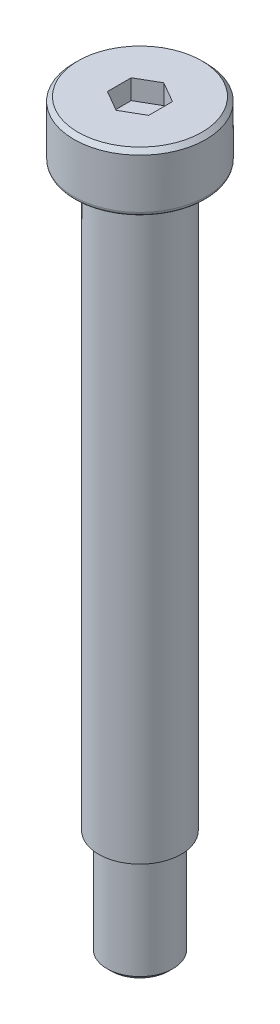
ISO-10303-21;
HEADER;
FILE_DESCRIPTION(('STEP AP214'),'2;1');
FILE_NAME('part.step','',(''),(''),'','','');
FILE_SCHEMA(('AUTOMOTIVE_DESIGN { 1 0 10303 214 1 1 1 1 }'));
ENDSEC;
DATA;
#1=APPLICATION_CONTEXT('core data for automotive mechanical design processes');
#2=APPLICATION_PROTOCOL_DEFINITION('international standard','automotive_design',2000,#1);
#3=PRODUCT_CONTEXT('',#1,'mechanical');
#4=PRODUCT('Part','Part','',(#3));
#5=PRODUCT_RELATED_PRODUCT_CATEGORY('part','',(#4));
#6=PRODUCT_DEFINITION_FORMATION('','',#4);
#7=PRODUCT_DEFINITION_CONTEXT('part definition',#1,'design');
#8=PRODUCT_DEFINITION('design','',#6,#7);
#9=PRODUCT_DEFINITION_SHAPE('','',#8);
#10=(LENGTH_UNIT() NAMED_UNIT(*) SI_UNIT(.MILLI.,.METRE.));
#11=(NAMED_UNIT(*) PLANE_ANGLE_UNIT() SI_UNIT($,.RADIAN.));
#12=(NAMED_UNIT(*) SI_UNIT($,.STERADIAN.) SOLID_ANGLE_UNIT());
#13=UNCERTAINTY_MEASURE_WITH_UNIT(LENGTH_MEASURE(1.E-05),#10,'distance_accuracy_value','');
#14=(GEOMETRIC_REPRESENTATION_CONTEXT(3) GLOBAL_UNCERTAINTY_ASSIGNED_CONTEXT((#13)) GLOBAL_UNIT_ASSIGNED_CONTEXT((#10,
#11,#12)) REPRESENTATION_CONTEXT('',''));
#15=CARTESIAN_POINT('',(0.,0.,0.));
#16=DIRECTION('',(0.,0.,1.));
#17=DIRECTION('',(1.,0.,0.));
#18=AXIS2_PLACEMENT_3D('',#15,#16,#17);
#19=CARTESIAN_POINT('',(0.,0.,0.));
#20=DIRECTION('',(0.,-1.,0.));
#21=DIRECTION('',(1.,0.,0.));
#22=AXIS2_PLACEMENT_3D('',#19,#20,#21);
#23=PLANE('',#22);
#24=CARTESIAN_POINT('',(0.,0.,0.));
#25=DIRECTION('',(0.,-1.,0.));
#26=DIRECTION('',(1.,0.,0.));
#27=AXIS2_PLACEMENT_3D('',#24,#25,#26);
#28=CIRCLE('',#27,7.49999999999998);
#29=CARTESIAN_POINT('',(7.49999999999998,0.,0.));
#30=VERTEX_POINT('',#29);
#31=EDGE_CURVE('E165',#30,#30,#28,.F.);
#32=ORIENTED_EDGE('',*,*,#31,.T.);
#33=EDGE_LOOP('',(#32));
#34=FACE_BOUND('',#33,.T.);
#35=DIRECTION('',(0.866025403784439,0.,-0.5));
#36=VECTOR('',#35,1.);
#37=CARTESIAN_POINT('',(0.,0.,2.88675134594813));
#38=LINE('',#37,#36);
#39=CARTESIAN_POINT('',(0.,0.,2.88675134594813));
#40=VERTEX_POINT('',#39);
#41=CARTESIAN_POINT('',(2.5,0.,1.44337567297407));
#42=VERTEX_POINT('',#41);
#43=EDGE_CURVE('E132',#40,#42,#38,.T.);
#44=ORIENTED_EDGE('',*,*,#43,.F.);
#45=DIRECTION('',(0.866025403784439,0.,0.5));
#46=VECTOR('',#45,1.);
#47=CARTESIAN_POINT('',(-2.5,0.,1.44337567297406));
#48=LINE('',#47,#46);
#49=CARTESIAN_POINT('',(-2.5,0.,1.44337567297406));
#50=VERTEX_POINT('',#49);
#51=EDGE_CURVE('E58',#50,#40,#48,.T.);
#52=ORIENTED_EDGE('',*,*,#51,.F.);
#53=DIRECTION('',(0.,0.,1.));
#54=VECTOR('',#53,1.);
#55=CARTESIAN_POINT('',(-2.5,0.,-1.44337567297407));
#56=LINE('',#55,#54);
#57=CARTESIAN_POINT('',(-2.5,0.,-1.44337567297407));
#58=VERTEX_POINT('',#57);
#59=EDGE_CURVE('E141',#58,#50,#56,.T.);
#60=ORIENTED_EDGE('',*,*,#59,.F.);
#61=DIRECTION('',(-0.866025403784439,0.,0.5));
#62=VECTOR('',#61,1.);
#63=CARTESIAN_POINT('',(0.,0.,-2.88675134594813));
#64=LINE('',#63,#62);
#65=CARTESIAN_POINT('',(0.,0.,-2.88675134594813));
#66=VERTEX_POINT('',#65);
#67=EDGE_CURVE('E139',#66,#58,#64,.T.);
#68=ORIENTED_EDGE('',*,*,#67,.F.);
#69=DIRECTION('',(-0.866025403784439,0.,-0.5));
#70=VECTOR('',#69,1.);
#71=CARTESIAN_POINT('',(2.5,0.,-1.44337567297407));
#72=LINE('',#71,#70);
#73=CARTESIAN_POINT('',(2.5,0.,-1.44337567297407));
#74=VERTEX_POINT('',#73);
#75=EDGE_CURVE('E106',#74,#66,#72,.T.);
#76=ORIENTED_EDGE('',*,*,#75,.F.);
#77=DIRECTION('',(0.,0.,-1.));
#78=VECTOR('',#77,1.);
#79=CARTESIAN_POINT('',(2.5,0.,1.44337567297407));
#80=LINE('',#79,#78);
#81=EDGE_CURVE('E135',#42,#74,#80,.T.);
#82=ORIENTED_EDGE('',*,*,#81,.F.);
#83=EDGE_LOOP('',(#44,#52,#60,#68,#76,#82));
#84=FACE_BOUND('',#83,.T.);
#85=ADVANCED_FACE('F42',(#34,#84),#23,.F.);
#86=CARTESIAN_POINT('',(0.,5.,0.));
#87=DIRECTION('',(0.,1.,0.));
#88=DIRECTION('',(-1.,0.,0.));
#89=AXIS2_PLACEMENT_3D('',#86,#87,#88);
#90=CYLINDRICAL_SURFACE('',#89,8.);
#91=CARTESIAN_POINT('',(0.,-6.50000000000001,0.));
#92=DIRECTION('',(0.,1.,0.));
#93=DIRECTION('',(-1.,0.,0.));
#94=AXIS2_PLACEMENT_3D('',#91,#92,#93);
#95=CIRCLE('',#94,8.);
#96=CARTESIAN_POINT('',(-8.,-6.50000000000001,0.));
#97=VERTEX_POINT('',#96);
#98=EDGE_CURVE('E171',#97,#97,#95,.T.);
#99=ORIENTED_EDGE('',*,*,#98,.T.);
#100=EDGE_LOOP('',(#99));
#101=FACE_BOUND('',#100,.T.);
#102=CARTESIAN_POINT('',(0.,-0.500000000000012,0.));
#103=DIRECTION('',(0.,-1.,0.));
#104=DIRECTION('',(1.,0.,0.));
#105=AXIS2_PLACEMENT_3D('',#102,#103,#104);
#106=CIRCLE('',#105,8.);
#107=CARTESIAN_POINT('',(8.,-0.500000000000011,0.));
#108=VERTEX_POINT('',#107);
#109=EDGE_CURVE('E168',#108,#108,#106,.T.);
#110=ORIENTED_EDGE('',*,*,#109,.T.);
#111=EDGE_LOOP('',(#110));
#112=FACE_BOUND('',#111,.T.);
#113=ADVANCED_FACE('F193',(#101,#112),#90,.T.);
#114=CARTESIAN_POINT('',(8.00000000000001,-7.,0.));
#115=DIRECTION('',(0.,1.,0.));
#116=DIRECTION('',(-1.,0.,0.));
#117=AXIS2_PLACEMENT_3D('',#114,#115,#116);
#118=PLANE('',#117);
#119=CARTESIAN_POINT('',(0.,-7.,0.));
#120=DIRECTION('',(0.,1.,0.));
#121=DIRECTION('',(-1.,0.,0.));
#122=AXIS2_PLACEMENT_3D('',#119,#120,#121);
#123=CIRCLE('',#122,7.5);
#124=CARTESIAN_POINT('',(-7.5,-7.00000000000001,0.));
#125=VERTEX_POINT('',#124);
#126=EDGE_CURVE('E174',#125,#125,#123,.F.);
#127=ORIENTED_EDGE('',*,*,#126,.T.);
#128=EDGE_LOOP('',(#127));
#129=FACE_BOUND('',#128,.T.);
#130=CARTESIAN_POINT('',(0.,-7.00000000000001,0.));
#131=DIRECTION('',(0.,1.,0.));
#132=DIRECTION('',(-1.,0.,0.));
#133=AXIS2_PLACEMENT_3D('',#130,#131,#132);
#134=CIRCLE('',#133,4.75);
#135=CARTESIAN_POINT('',(-4.75,-7.00000000000001,0.));
#136=VERTEX_POINT('',#135);
#137=EDGE_CURVE('E162',#136,#136,#134,.T.);
#138=ORIENTED_EDGE('',*,*,#137,.T.);
#139=EDGE_LOOP('',(#138));
#140=FACE_BOUND('',#139,.T.);
#141=ADVANCED_FACE('F201',(#129,#140),#118,.F.);
#142=CARTESIAN_POINT('',(0.,5.,0.));
#143=DIRECTION('',(0.,1.,0.));
#144=DIRECTION('',(-1.,0.,0.));
#145=AXIS2_PLACEMENT_3D('',#142,#143,#144);
#146=CYLINDRICAL_SURFACE('',#145,4.75);
#147=ORIENTED_EDGE('',*,*,#137,.F.);
#148=EDGE_LOOP('',(#147));
#149=FACE_BOUND('',#148,.T.);
#150=CARTESIAN_POINT('',(0.,-7.50000000000001,0.));
#151=DIRECTION('',(0.,1.,0.));
#152=DIRECTION('',(-1.,0.,0.));
#153=AXIS2_PLACEMENT_3D('',#150,#151,#152);
#154=CIRCLE('',#153,4.75);
#155=CARTESIAN_POINT('',(-4.75,-7.50000000000001,0.));
#156=VERTEX_POINT('',#155);
#157=EDGE_CURVE('E159',#156,#156,#154,.T.);
#158=ORIENTED_EDGE('',*,*,#157,.T.);
#159=EDGE_LOOP('',(#158));
#160=FACE_BOUND('',#159,.T.);
#161=ADVANCED_FACE('F255',(#149,#160),#146,.T.);
#162=CARTESIAN_POINT('',(4.75,-7.50000000000001,0.));
#163=DIRECTION('',(0.,-1.,0.));
#164=DIRECTION('',(1.,0.,0.));
#165=AXIS2_PLACEMENT_3D('',#162,#163,#164);
#166=PLANE('',#165);
#167=ORIENTED_EDGE('',*,*,#157,.F.);
#168=EDGE_LOOP('',(#167));
#169=FACE_BOUND('',#168,.T.);
#170=CARTESIAN_POINT('',(0.,-7.50000000000001,0.));
#171=DIRECTION('',(0.,1.,0.));
#172=DIRECTION('',(-1.,0.,0.));
#173=AXIS2_PLACEMENT_3D('',#170,#171,#172);
#174=CIRCLE('',#173,5.);
#175=CARTESIAN_POINT('',(-5.,-7.50000000000001,0.));
#176=VERTEX_POINT('',#175);
#177=EDGE_CURVE('E156',#176,#176,#174,.T.);
#178=ORIENTED_EDGE('',*,*,#177,.T.);
#179=EDGE_LOOP('',(#178));
#180=FACE_BOUND('',#179,.T.);
#181=ADVANCED_FACE('F251',(#169,#180),#166,.F.);
#182=CARTESIAN_POINT('',(0.,5.,0.));
#183=DIRECTION('',(0.,1.,0.));
#184=DIRECTION('',(-1.,0.,0.));
#185=AXIS2_PLACEMENT_3D('',#182,#183,#184);
#186=CYLINDRICAL_SURFACE('',#185,5.00000000000001);
#187=ORIENTED_EDGE('',*,*,#177,.F.);
#188=EDGE_LOOP('',(#187));
#189=FACE_BOUND('',#188,.T.);
#190=CARTESIAN_POINT('',(0.,-77.,0.));
#191=DIRECTION('',(0.,1.,0.));
#192=DIRECTION('',(-1.,0.,0.));
#193=AXIS2_PLACEMENT_3D('',#190,#191,#192);
#194=CIRCLE('',#193,5.00000000000002);
#195=CARTESIAN_POINT('',(-5.00000000000001,-77.,0.));
#196=VERTEX_POINT('',#195);
#197=EDGE_CURVE('E153',#196,#196,#194,.T.);
#198=ORIENTED_EDGE('',*,*,#197,.T.);
#199=EDGE_LOOP('',(#198));
#200=FACE_BOUND('',#199,.T.);
#201=ADVANCED_FACE('F247',(#189,#200),#186,.T.);
#202=CARTESIAN_POINT('',(5.00000000000002,-77.,0.));
#203=DIRECTION('',(0.,1.,0.));
#204=DIRECTION('',(-1.,0.,0.));
#205=AXIS2_PLACEMENT_3D('',#202,#203,#204);
#206=PLANE('',#205);
#207=ORIENTED_EDGE('',*,*,#197,.F.);
#208=EDGE_LOOP('',(#207));
#209=FACE_BOUND('',#208,.T.);
#210=CARTESIAN_POINT('',(0.,-77.,0.));
#211=DIRECTION('',(0.,1.,0.));
#212=DIRECTION('',(-1.,0.,0.));
#213=AXIS2_PLACEMENT_3D('',#210,#211,#212);
#214=CIRCLE('',#213,4.);
#215=CARTESIAN_POINT('',(-3.99999999999999,-77.,0.));
#216=VERTEX_POINT('',#215);
#217=EDGE_CURVE('E145',#216,#216,#214,.T.);
#218=ORIENTED_EDGE('',*,*,#217,.T.);
#219=EDGE_LOOP('',(#218));
#220=FACE_BOUND('',#219,.T.);
#221=ADVANCED_FACE('F244',(#209,#220),#206,.F.);
#222=CARTESIAN_POINT('',(0.,5.,0.));
#223=DIRECTION('',(0.,1.,0.));
#224=DIRECTION('',(-1.,0.,0.));
#225=AXIS2_PLACEMENT_3D('',#222,#223,#224);
#226=CYLINDRICAL_SURFACE('',#225,4.);
#227=CARTESIAN_POINT('',(0.,-89.5,0.));
#228=DIRECTION('',(0.,1.,0.));
#229=DIRECTION('',(-1.,0.,0.));
#230=AXIS2_PLACEMENT_3D('',#227,#228,#229);
#231=CIRCLE('',#230,4.);
#232=CARTESIAN_POINT('',(-3.99999999999999,-89.5,0.));
#233=VERTEX_POINT('',#232);
#234=EDGE_CURVE('E51',#233,#233,#231,.T.);
#235=ORIENTED_EDGE('',*,*,#234,.T.);
#236=EDGE_LOOP('',(#235));
#237=FACE_BOUND('',#236,.T.);
#238=ORIENTED_EDGE('',*,*,#217,.F.);
#239=EDGE_LOOP('',(#238));
#240=FACE_BOUND('',#239,.T.);
#241=ADVANCED_FACE('F179',(#237,#240),#226,.T.);
#242=CARTESIAN_POINT('',(4.00000000000001,-90.,0.));
#243=DIRECTION('',(0.,1.,0.));
#244=DIRECTION('',(-1.,0.,0.));
#245=AXIS2_PLACEMENT_3D('',#242,#243,#244);
#246=PLANE('',#245);
#247=CARTESIAN_POINT('',(0.,-90.,0.));
#248=DIRECTION('',(0.,1.,0.));
#249=DIRECTION('',(-1.,0.,0.));
#250=AXIS2_PLACEMENT_3D('',#247,#248,#249);
#251=CIRCLE('',#250,3.49999999999997);
#252=CARTESIAN_POINT('',(-3.49999999999996,-90.,0.));
#253=VERTEX_POINT('',#252);
#254=EDGE_CURVE('E11',#253,#253,#251,.F.);
#255=ORIENTED_EDGE('',*,*,#254,.T.);
#256=EDGE_LOOP('',(#255));
#257=FACE_BOUND('',#256,.T.);
#258=ADVANCED_FACE('F239',(#257),#246,.F.);
#259=CARTESIAN_POINT('',(-2.5,-2.4,1.44337567297406));
#260=DIRECTION('',(-0.5,0.,0.866025403784439));
#261=DIRECTION('',(0.866025403784439,0.,0.5));
#262=AXIS2_PLACEMENT_3D('',#259,#260,#261);
#263=PLANE('',#262);
#264=ORIENTED_EDGE('',*,*,#51,.T.);
#265=DIRECTION('',(0.,1.,0.));
#266=VECTOR('',#265,1.);
#267=CARTESIAN_POINT('',(0.,-2.4,2.88675134594813));
#268=LINE('',#267,#266);
#269=CARTESIAN_POINT('',(0.,-2.4,2.88675134594813));
#270=VERTEX_POINT('',#269);
#271=EDGE_CURVE('E88',#270,#40,#268,.T.);
#272=ORIENTED_EDGE('',*,*,#271,.F.);
#273=DIRECTION('',(0.866025403784439,0.,0.5));
#274=VECTOR('',#273,1.);
#275=CARTESIAN_POINT('',(-2.5,-2.4,1.44337567297406));
#276=LINE('',#275,#274);
#277=CARTESIAN_POINT('',(-2.5,-2.4,1.44337567297406));
#278=VERTEX_POINT('',#277);
#279=EDGE_CURVE('E143',#278,#270,#276,.T.);
#280=ORIENTED_EDGE('',*,*,#279,.F.);
#281=DIRECTION('',(0.,1.,0.));
#282=VECTOR('',#281,1.);
#283=CARTESIAN_POINT('',(-2.5,-2.4,1.44337567297406));
#284=LINE('',#283,#282);
#285=EDGE_CURVE('E66',#278,#50,#284,.T.);
#286=ORIENTED_EDGE('',*,*,#285,.T.);
#287=EDGE_LOOP('',(#264,#272,#280,#286));
#288=FACE_BOUND('',#287,.T.);
#289=ADVANCED_FACE('F229',(#288),#263,.F.);
#290=CARTESIAN_POINT('',(-2.5,-2.4,-1.44337567297407));
#291=DIRECTION('',(-1.,0.,0.));
#292=DIRECTION('',(0.,-1.,0.));
#293=AXIS2_PLACEMENT_3D('',#290,#291,#292);
#294=PLANE('',#293);
#295=ORIENTED_EDGE('',*,*,#59,.T.);
#296=ORIENTED_EDGE('',*,*,#285,.F.);
#297=DIRECTION('',(0.,0.,1.));
#298=VECTOR('',#297,1.);
#299=CARTESIAN_POINT('',(-2.5,-2.4,-1.44337567297407));
#300=LINE('',#299,#298);
#301=CARTESIAN_POINT('',(-2.5,-2.4,-1.44337567297407));
#302=VERTEX_POINT('',#301);
#303=EDGE_CURVE('E118',#302,#278,#300,.T.);
#304=ORIENTED_EDGE('',*,*,#303,.F.);
#305=DIRECTION('',(0.,1.,0.));
#306=VECTOR('',#305,1.);
#307=CARTESIAN_POINT('',(-2.5,-2.4,-1.44337567297407));
#308=LINE('',#307,#306);
#309=EDGE_CURVE('E110',#302,#58,#308,.T.);
#310=ORIENTED_EDGE('',*,*,#309,.T.);
#311=EDGE_LOOP('',(#295,#296,#304,#310));
#312=FACE_BOUND('',#311,.T.);
#313=ADVANCED_FACE('F226',(#312),#294,.F.);
#314=CARTESIAN_POINT('',(0.,-2.4,-2.88675134594813));
#315=DIRECTION('',(-0.5,0.,-0.866025403784439));
#316=DIRECTION('',(-0.866025403784439,0.,0.5));
#317=AXIS2_PLACEMENT_3D('',#314,#315,#316);
#318=PLANE('',#317);
#319=ORIENTED_EDGE('',*,*,#67,.T.);
#320=ORIENTED_EDGE('',*,*,#309,.F.);
#321=DIRECTION('',(-0.866025403784439,0.,0.5));
#322=VECTOR('',#321,1.);
#323=CARTESIAN_POINT('',(0.,-2.4,-2.88675134594813));
#324=LINE('',#323,#322);
#325=CARTESIAN_POINT('',(0.,-2.4,-2.88675134594813));
#326=VERTEX_POINT('',#325);
#327=EDGE_CURVE('E114',#326,#302,#324,.T.);
#328=ORIENTED_EDGE('',*,*,#327,.F.);
#329=DIRECTION('',(0.,1.,0.));
#330=VECTOR('',#329,1.);
#331=CARTESIAN_POINT('',(0.,-2.4,-2.88675134594813));
#332=LINE('',#331,#330);
#333=EDGE_CURVE('E99',#326,#66,#332,.T.);
#334=ORIENTED_EDGE('',*,*,#333,.T.);
#335=EDGE_LOOP('',(#319,#320,#328,#334));
#336=FACE_BOUND('',#335,.T.);
#337=ADVANCED_FACE('F115',(#336),#318,.F.);
#338=CARTESIAN_POINT('',(2.5,-2.4,-1.44337567297407));
#339=DIRECTION('',(0.5,0.,-0.866025403784439));
#340=DIRECTION('',(-0.866025403784439,0.,-0.5));
#341=AXIS2_PLACEMENT_3D('',#338,#339,#340);
#342=PLANE('',#341);
#343=ORIENTED_EDGE('',*,*,#75,.T.);
#344=ORIENTED_EDGE('',*,*,#333,.F.);
#345=DIRECTION('',(-0.866025403784439,0.,-0.5));
#346=VECTOR('',#345,1.);
#347=CARTESIAN_POINT('',(2.5,-2.4,-1.44337567297407));
#348=LINE('',#347,#346);
#349=CARTESIAN_POINT('',(2.5,-2.4,-1.44337567297407));
#350=VERTEX_POINT('',#349);
#351=EDGE_CURVE('E103',#350,#326,#348,.T.);
#352=ORIENTED_EDGE('',*,*,#351,.F.);
#353=DIRECTION('',(0.,1.,0.));
#354=VECTOR('',#353,1.);
#355=CARTESIAN_POINT('',(2.5,-2.4,-1.44337567297407));
#356=LINE('',#355,#354);
#357=EDGE_CURVE('E111',#350,#74,#356,.T.);
#358=ORIENTED_EDGE('',*,*,#357,.T.);
#359=EDGE_LOOP('',(#343,#344,#352,#358));
#360=FACE_BOUND('',#359,.T.);
#361=ADVANCED_FACE('F101',(#360),#342,.F.);
#362=CARTESIAN_POINT('',(2.5,-2.4,1.44337567297407));
#363=DIRECTION('',(1.,0.,0.));
#364=DIRECTION('',(0.,0.,-1.));
#365=AXIS2_PLACEMENT_3D('',#362,#363,#364);
#366=PLANE('',#365);
#367=ORIENTED_EDGE('',*,*,#81,.T.);
#368=ORIENTED_EDGE('',*,*,#357,.F.);
#369=DIRECTION('',(0.,0.,-1.));
#370=VECTOR('',#369,1.);
#371=CARTESIAN_POINT('',(2.5,-2.4,1.44337567297407));
#372=LINE('',#371,#370);
#373=CARTESIAN_POINT('',(2.5,-2.4,1.44337567297407));
#374=VERTEX_POINT('',#373);
#375=EDGE_CURVE('E124',#374,#350,#372,.T.);
#376=ORIENTED_EDGE('',*,*,#375,.F.);
#377=DIRECTION('',(0.,1.,0.));
#378=VECTOR('',#377,1.);
#379=CARTESIAN_POINT('',(2.5,-2.4,1.44337567297407));
#380=LINE('',#379,#378);
#381=EDGE_CURVE('E148',#374,#42,#380,.T.);
#382=ORIENTED_EDGE('',*,*,#381,.T.);
#383=EDGE_LOOP('',(#367,#368,#376,#382));
#384=FACE_BOUND('',#383,.T.);
#385=ADVANCED_FACE('F222',(#384),#366,.F.);
#386=CARTESIAN_POINT('',(0.,-2.4,2.88675134594813));
#387=DIRECTION('',(0.5,0.,0.866025403784439));
#388=DIRECTION('',(0.866025403784439,0.,-0.5));
#389=AXIS2_PLACEMENT_3D('',#386,#387,#388);
#390=PLANE('',#389);
#391=ORIENTED_EDGE('',*,*,#43,.T.);
#392=ORIENTED_EDGE('',*,*,#381,.F.);
#393=DIRECTION('',(0.866025403784439,0.,-0.5));
#394=VECTOR('',#393,1.);
#395=CARTESIAN_POINT('',(0.,-2.4,2.88675134594813));
#396=LINE('',#395,#394);
#397=EDGE_CURVE('E126',#270,#374,#396,.T.);
#398=ORIENTED_EDGE('',*,*,#397,.F.);
#399=ORIENTED_EDGE('',*,*,#271,.T.);
#400=EDGE_LOOP('',(#391,#392,#398,#399));
#401=FACE_BOUND('',#400,.T.);
#402=ADVANCED_FACE('F213',(#401),#390,.F.);
#403=CARTESIAN_POINT('',(0.,-2.4,0.));
#404=DIRECTION('',(0.,1.,0.));
#405=DIRECTION('',(-1.,0.,0.));
#406=AXIS2_PLACEMENT_3D('',#403,#404,#405);
#407=PLANE('',#406);
#408=ORIENTED_EDGE('',*,*,#279,.T.);
#409=ORIENTED_EDGE('',*,*,#397,.T.);
#410=ORIENTED_EDGE('',*,*,#375,.T.);
#411=ORIENTED_EDGE('',*,*,#351,.T.);
#412=ORIENTED_EDGE('',*,*,#327,.T.);
#413=ORIENTED_EDGE('',*,*,#303,.T.);
#414=EDGE_LOOP('',(#408,#409,#410,#411,#412,#413));
#415=FACE_BOUND('',#414,.T.);
#416=ADVANCED_FACE('F121',(#415),#407,.T.);
#417=CARTESIAN_POINT('',(0.,0.,0.));
#418=DIRECTION('',(0.,-1.,0.));
#419=DIRECTION('',(1.,0.,0.));
#420=AXIS2_PLACEMENT_3D('',#417,#418,#419);
#421=CONICAL_SURFACE('',#420,7.49999999999998,0.785398163397462);
#422=ORIENTED_EDGE('',*,*,#109,.F.);
#423=EDGE_LOOP('',(#422));
#424=FACE_BOUND('',#423,.T.);
#425=ORIENTED_EDGE('',*,*,#31,.F.);
#426=EDGE_LOOP('',(#425));
#427=FACE_BOUND('',#426,.T.);
#428=ADVANCED_FACE('F189',(#424,#427),#421,.T.);
#429=CARTESIAN_POINT('',(0.,-6.50000000000001,0.));
#430=DIRECTION('',(0.,1.,0.));
#431=DIRECTION('',(-1.,0.,0.));
#432=AXIS2_PLACEMENT_3D('',#429,#430,#431);
#433=TOROIDAL_SURFACE('',#432,7.5,0.5);
#434=ORIENTED_EDGE('',*,*,#126,.F.);
#435=EDGE_LOOP('',(#434));
#436=FACE_BOUND('',#435,.T.);
#437=ORIENTED_EDGE('',*,*,#98,.F.);
#438=EDGE_LOOP('',(#437));
#439=FACE_BOUND('',#438,.T.);
#440=ADVANCED_FACE('F183',(#436,#439),#433,.T.);
#441=CARTESIAN_POINT('',(0.,-89.5,0.));
#442=DIRECTION('',(0.,1.,0.));
#443=DIRECTION('',(-1.,0.,0.));
#444=AXIS2_PLACEMENT_3D('',#441,#442,#443);
#445=CONICAL_SURFACE('',#444,4.,0.785398163397439);
#446=ORIENTED_EDGE('',*,*,#254,.F.);
#447=EDGE_LOOP('',(#446));
#448=FACE_BOUND('',#447,.T.);
#449=ORIENTED_EDGE('',*,*,#234,.F.);
#450=EDGE_LOOP('',(#449));
#451=FACE_BOUND('',#450,.T.);
#452=ADVANCED_FACE('F45',(#448,#451),#445,.T.);
#453=CLOSED_SHELL('',(#85,#113,#141,#161,#181,#201,#221,#241,#258,#289,#313,#337,#361,#385,#402,
#416,#428,#440,#452));
#454=MANIFOLD_SOLID_BREP('B2',#453);
#455=ADVANCED_BREP_SHAPE_REPRESENTATION('',(#18,#454),#14);
#456=SHAPE_DEFINITION_REPRESENTATION(#9,#455);
ENDSEC;
END-ISO-10303-21;
